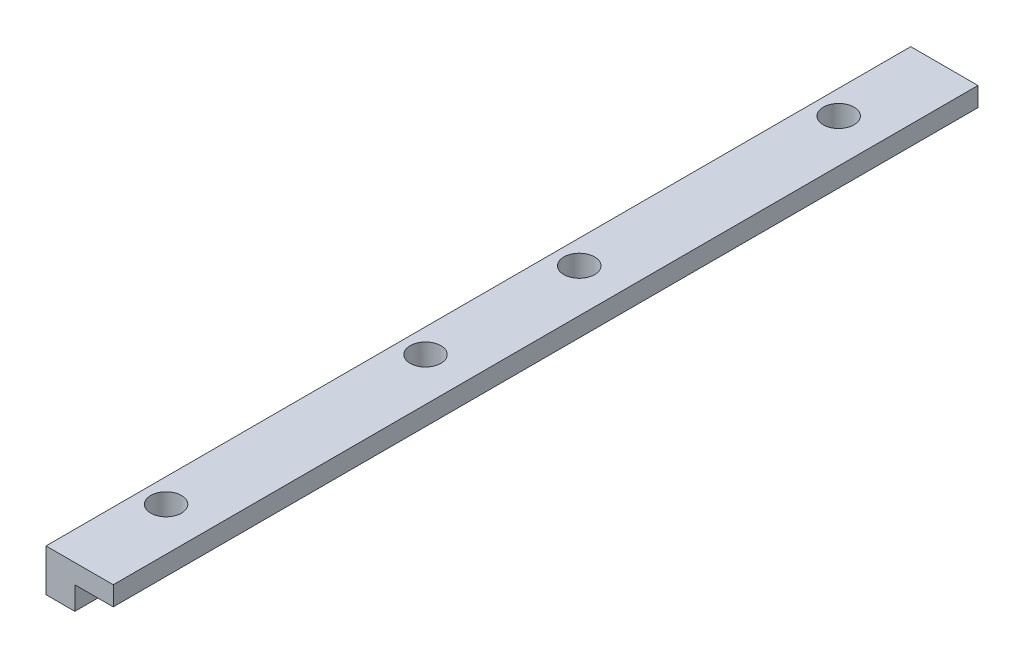
ISO-10303-21;
HEADER;
FILE_DESCRIPTION(('STEP AP214'),'2;1');
FILE_NAME('part.step','',(''),(''),'','','');
FILE_SCHEMA(('AUTOMOTIVE_DESIGN { 1 0 10303 214 1 1 1 1 }'));
ENDSEC;
DATA;
#1=APPLICATION_CONTEXT('core data for automotive mechanical design processes');
#2=APPLICATION_PROTOCOL_DEFINITION('international standard','automotive_design',2000,#1);
#3=PRODUCT_CONTEXT('',#1,'mechanical');
#4=PRODUCT('Part','Part','',(#3));
#5=PRODUCT_RELATED_PRODUCT_CATEGORY('part','',(#4));
#6=PRODUCT_DEFINITION_FORMATION('','',#4);
#7=PRODUCT_DEFINITION_CONTEXT('part definition',#1,'design');
#8=PRODUCT_DEFINITION('design','',#6,#7);
#9=PRODUCT_DEFINITION_SHAPE('','',#8);
#10=(LENGTH_UNIT() NAMED_UNIT(*) SI_UNIT(.MILLI.,.METRE.));
#11=(NAMED_UNIT(*) PLANE_ANGLE_UNIT() SI_UNIT($,.RADIAN.));
#12=(NAMED_UNIT(*) SI_UNIT($,.STERADIAN.) SOLID_ANGLE_UNIT());
#13=UNCERTAINTY_MEASURE_WITH_UNIT(LENGTH_MEASURE(1.E-05),#10,'distance_accuracy_value','');
#14=(GEOMETRIC_REPRESENTATION_CONTEXT(3) GLOBAL_UNCERTAINTY_ASSIGNED_CONTEXT((#13)) GLOBAL_UNIT_ASSIGNED_CONTEXT((#10,
#11,#12)) REPRESENTATION_CONTEXT('',''));
#15=CARTESIAN_POINT('',(0.,0.,0.));
#16=DIRECTION('',(0.,0.,1.));
#17=DIRECTION('',(1.,0.,0.));
#18=AXIS2_PLACEMENT_3D('',#15,#16,#17);
#19=CARTESIAN_POINT('',(3.,0.,90.));
#20=DIRECTION('',(-1.,0.,0.));
#21=DIRECTION('',(0.,0.,1.));
#22=AXIS2_PLACEMENT_3D('',#19,#20,#21);
#23=PLANE('',#22);
#24=DIRECTION('',(0.,0.,-1.));
#25=VECTOR('',#24,1.);
#26=CARTESIAN_POINT('',(3.,0.,90.));
#27=LINE('',#26,#25);
#28=CARTESIAN_POINT('',(3.,0.,78.4801315846429));
#29=VERTEX_POINT('',#28);
#30=CARTESIAN_POINT('',(3.,0.,54.5198684153571));
#31=VERTEX_POINT('',#30);
#32=EDGE_CURVE('E150',#29,#31,#27,.T.);
#33=ORIENTED_EDGE('',*,*,#32,.T.);
#34=DIRECTION('',(0.,1.,0.));
#35=VECTOR('',#34,1.);
#36=CARTESIAN_POINT('',(3.,0.,54.5198684153571));
#37=LINE('',#36,#35);
#38=CARTESIAN_POINT('',(3.,2.4,54.5198684153571));
#39=VERTEX_POINT('',#38);
#40=EDGE_CURVE('E134',#31,#39,#37,.T.);
#41=ORIENTED_EDGE('',*,*,#40,.T.);
#42=DIRECTION('',(0.,0.,-1.));
#43=VECTOR('',#42,1.);
#44=CARTESIAN_POINT('',(3.,2.4,90.));
#45=LINE('',#44,#43);
#46=CARTESIAN_POINT('',(3.,2.4,78.4801315846429));
#47=VERTEX_POINT('',#46);
#48=EDGE_CURVE('E167',#47,#39,#45,.T.);
#49=ORIENTED_EDGE('',*,*,#48,.F.);
#50=DIRECTION('',(0.,1.,0.));
#51=VECTOR('',#50,1.);
#52=CARTESIAN_POINT('',(3.,0.,78.4801315846429));
#53=LINE('',#52,#51);
#54=EDGE_CURVE('E58',#47,#29,#53,.F.);
#55=ORIENTED_EDGE('',*,*,#54,.T.);
#56=EDGE_LOOP('',(#33,#41,#49,#55));
#57=FACE_BOUND('',#56,.T.);
#58=ADVANCED_FACE('F35',(#57),#23,.F.);
#59=CARTESIAN_POINT('',(3.,0.,90.));
#60=VERTEX_POINT('',#59);
#61=CARTESIAN_POINT('',(3.,0.,81.5198684153571));
#62=VERTEX_POINT('',#61);
#63=EDGE_CURVE('E43',#60,#62,#27,.T.);
#64=ORIENTED_EDGE('',*,*,#63,.T.);
#65=DIRECTION('',(0.,1.,0.));
#66=VECTOR('',#65,1.);
#67=CARTESIAN_POINT('',(3.,0.,81.5198684153571));
#68=LINE('',#67,#66);
#69=CARTESIAN_POINT('',(3.,2.4,81.5198684153571));
#70=VERTEX_POINT('',#69);
#71=EDGE_CURVE('E243',#62,#70,#68,.T.);
#72=ORIENTED_EDGE('',*,*,#71,.T.);
#73=CARTESIAN_POINT('',(3.,2.4,90.));
#74=VERTEX_POINT('',#73);
#75=EDGE_CURVE('E159',#74,#70,#45,.T.);
#76=ORIENTED_EDGE('',*,*,#75,.F.);
#77=DIRECTION('',(0.,1.,0.));
#78=VECTOR('',#77,1.);
#79=CARTESIAN_POINT('',(3.,0.,90.));
#80=LINE('',#79,#78);
#81=EDGE_CURVE('E214',#60,#74,#80,.T.);
#82=ORIENTED_EDGE('',*,*,#81,.F.);
#83=EDGE_LOOP('',(#64,#72,#76,#82));
#84=FACE_BOUND('',#83,.T.);
#85=ADVANCED_FACE('F300',(#84),#23,.F.);
#86=CARTESIAN_POINT('',(3.,0.,35.4801315846429));
#87=VERTEX_POINT('',#86);
#88=CARTESIAN_POINT('',(3.,0.,11.5198684153571));
#89=VERTEX_POINT('',#88);
#90=EDGE_CURVE('E157',#87,#89,#27,.T.);
#91=ORIENTED_EDGE('',*,*,#90,.T.);
#92=DIRECTION('',(0.,1.,0.));
#93=VECTOR('',#92,1.);
#94=CARTESIAN_POINT('',(3.,0.,11.5198684153571));
#95=LINE('',#94,#93);
#96=CARTESIAN_POINT('',(3.,2.4,11.5198684153571));
#97=VERTEX_POINT('',#96);
#98=EDGE_CURVE('E231',#89,#97,#95,.T.);
#99=ORIENTED_EDGE('',*,*,#98,.T.);
#100=CARTESIAN_POINT('',(3.,2.4,35.4801315846429));
#101=VERTEX_POINT('',#100);
#102=EDGE_CURVE('E169',#101,#97,#45,.T.);
#103=ORIENTED_EDGE('',*,*,#102,.F.);
#104=DIRECTION('',(0.,1.,0.));
#105=VECTOR('',#104,1.);
#106=CARTESIAN_POINT('',(3.,0.,35.4801315846429));
#107=LINE('',#106,#105);
#108=EDGE_CURVE('E222',#101,#87,#107,.F.);
#109=ORIENTED_EDGE('',*,*,#108,.T.);
#110=EDGE_LOOP('',(#91,#99,#103,#109));
#111=FACE_BOUND('',#110,.T.);
#112=ADVANCED_FACE('F304',(#111),#23,.F.);
#113=CARTESIAN_POINT('',(3.,2.4,51.4801315846429));
#114=VERTEX_POINT('',#113);
#115=CARTESIAN_POINT('',(3.,2.4,38.5198684153571));
#116=VERTEX_POINT('',#115);
#117=EDGE_CURVE('E168',#114,#116,#45,.T.);
#118=ORIENTED_EDGE('',*,*,#117,.F.);
#119=DIRECTION('',(0.,1.,0.));
#120=VECTOR('',#119,1.);
#121=CARTESIAN_POINT('',(3.,0.,51.4801315846429));
#122=LINE('',#121,#120);
#123=CARTESIAN_POINT('',(3.,0.,51.4801315846429));
#124=VERTEX_POINT('',#123);
#125=EDGE_CURVE('E50',#114,#124,#122,.F.);
#126=ORIENTED_EDGE('',*,*,#125,.T.);
#127=CARTESIAN_POINT('',(3.,0.,38.5198684153571));
#128=VERTEX_POINT('',#127);
#129=EDGE_CURVE('E152',#124,#128,#27,.T.);
#130=ORIENTED_EDGE('',*,*,#129,.T.);
#131=DIRECTION('',(0.,1.,0.));
#132=VECTOR('',#131,1.);
#133=CARTESIAN_POINT('',(3.,0.,38.5198684153571));
#134=LINE('',#133,#132);
#135=EDGE_CURVE('E208',#128,#116,#134,.T.);
#136=ORIENTED_EDGE('',*,*,#135,.T.);
#137=EDGE_LOOP('',(#118,#126,#130,#136));
#138=FACE_BOUND('',#137,.T.);
#139=ADVANCED_FACE('F298',(#138),#23,.F.);
#140=CARTESIAN_POINT('',(0.,0.,90.));
#141=DIRECTION('',(1.,0.,0.));
#142=DIRECTION('',(0.,0.,-1.));
#143=AXIS2_PLACEMENT_3D('',#140,#141,#142);
#144=PLANE('',#143);
#145=DIRECTION('',(0.,-1.,0.));
#146=VECTOR('',#145,1.);
#147=CARTESIAN_POINT('',(0.,0.,0.));
#148=LINE('',#147,#146);
#149=CARTESIAN_POINT('',(0.,4.4,0.));
#150=VERTEX_POINT('',#149);
#151=CARTESIAN_POINT('',(0.,0.,0.));
#152=VERTEX_POINT('',#151);
#153=EDGE_CURVE('E205',#150,#152,#148,.T.);
#154=ORIENTED_EDGE('',*,*,#153,.T.);
#155=DIRECTION('',(0.,0.,-1.));
#156=VECTOR('',#155,1.);
#157=CARTESIAN_POINT('',(0.,0.,90.));
#158=LINE('',#157,#156);
#159=CARTESIAN_POINT('',(0.,0.,90.));
#160=VERTEX_POINT('',#159);
#161=EDGE_CURVE('E11',#160,#152,#158,.T.);
#162=ORIENTED_EDGE('',*,*,#161,.F.);
#163=DIRECTION('',(0.,-1.,0.));
#164=VECTOR('',#163,1.);
#165=CARTESIAN_POINT('',(0.,0.,90.));
#166=LINE('',#165,#164);
#167=CARTESIAN_POINT('',(0.,4.4,90.));
#168=VERTEX_POINT('',#167);
#169=EDGE_CURVE('E196',#168,#160,#166,.T.);
#170=ORIENTED_EDGE('',*,*,#169,.F.);
#171=DIRECTION('',(0.,0.,-1.));
#172=VECTOR('',#171,1.);
#173=CARTESIAN_POINT('',(0.,4.4,90.));
#174=LINE('',#173,#172);
#175=EDGE_CURVE('E188',#168,#150,#174,.T.);
#176=ORIENTED_EDGE('',*,*,#175,.T.);
#177=EDGE_LOOP('',(#154,#162,#170,#176));
#178=FACE_BOUND('',#177,.T.);
#179=ADVANCED_FACE('F37',(#178),#144,.F.);
#180=CARTESIAN_POINT('',(0.,0.,90.));
#181=DIRECTION('',(0.,1.,0.));
#182=DIRECTION('',(0.,0.,1.));
#183=AXIS2_PLACEMENT_3D('',#180,#181,#182);
#184=PLANE('',#183);
#185=ORIENTED_EDGE('',*,*,#129,.F.);
#186=CARTESIAN_POINT('',(2.49999999999998,0.,53.));
#187=DIRECTION('',(0.,1.,0.));
#188=DIRECTION('',(0.,0.,-1.));
#189=AXIS2_PLACEMENT_3D('',#186,#187,#188);
#190=CIRCLE('',#189,1.6);
#191=EDGE_CURVE('E137',#124,#31,#190,.T.);
#192=ORIENTED_EDGE('',*,*,#191,.T.);
#193=ORIENTED_EDGE('',*,*,#32,.F.);
#194=CARTESIAN_POINT('',(2.49999999999998,0.,80.));
#195=DIRECTION('',(0.,1.,0.));
#196=DIRECTION('',(0.,0.,-1.));
#197=AXIS2_PLACEMENT_3D('',#194,#195,#196);
#198=CIRCLE('',#197,1.6);
#199=EDGE_CURVE('E251',#29,#62,#198,.T.);
#200=ORIENTED_EDGE('',*,*,#199,.T.);
#201=ORIENTED_EDGE('',*,*,#63,.F.);
#202=DIRECTION('',(1.,0.,0.));
#203=VECTOR('',#202,1.);
#204=CARTESIAN_POINT('',(0.,0.,90.));
#205=LINE('',#204,#203);
#206=EDGE_CURVE('E216',#160,#60,#205,.T.);
#207=ORIENTED_EDGE('',*,*,#206,.F.);
#208=ORIENTED_EDGE('',*,*,#161,.T.);
#209=DIRECTION('',(1.,0.,0.));
#210=VECTOR('',#209,1.);
#211=CARTESIAN_POINT('',(0.,0.,0.));
#212=LINE('',#211,#210);
#213=CARTESIAN_POINT('',(3.,0.,0.));
#214=VERTEX_POINT('',#213);
#215=EDGE_CURVE('E203',#152,#214,#212,.T.);
#216=ORIENTED_EDGE('',*,*,#215,.T.);
#217=CARTESIAN_POINT('',(3.,0.,8.48013158464294));
#218=VERTEX_POINT('',#217);
#219=EDGE_CURVE('E155',#218,#214,#27,.T.);
#220=ORIENTED_EDGE('',*,*,#219,.F.);
#221=CARTESIAN_POINT('',(2.49999999999998,0.,9.99999999999999));
#222=DIRECTION('',(0.,1.,0.));
#223=DIRECTION('',(0.,0.,1.));
#224=AXIS2_PLACEMENT_3D('',#221,#222,#223);
#225=CIRCLE('',#224,1.6);
#226=EDGE_CURVE('E239',#218,#89,#225,.T.);
#227=ORIENTED_EDGE('',*,*,#226,.T.);
#228=ORIENTED_EDGE('',*,*,#90,.F.);
#229=CARTESIAN_POINT('',(2.49999999999998,0.,37.));
#230=DIRECTION('',(0.,1.,0.));
#231=DIRECTION('',(0.,0.,1.));
#232=AXIS2_PLACEMENT_3D('',#229,#230,#231);
#233=CIRCLE('',#232,1.6);
#234=EDGE_CURVE('E227',#87,#128,#233,.T.);
#235=ORIENTED_EDGE('',*,*,#234,.T.);
#236=EDGE_LOOP('',(#185,#192,#193,#200,#201,#207,#208,#216,#220,#227,#228,#235));
#237=FACE_BOUND('',#236,.T.);
#238=ADVANCED_FACE('F148',(#237),#184,.F.);
#239=CARTESIAN_POINT('',(3.,2.4,8.48013158464294));
#240=VERTEX_POINT('',#239);
#241=CARTESIAN_POINT('',(3.,2.4,0.));
#242=VERTEX_POINT('',#241);
#243=EDGE_CURVE('E173',#240,#242,#45,.T.);
#244=ORIENTED_EDGE('',*,*,#243,.F.);
#245=DIRECTION('',(0.,1.,0.));
#246=VECTOR('',#245,1.);
#247=CARTESIAN_POINT('',(3.,0.,8.48013158464294));
#248=LINE('',#247,#246);
#249=EDGE_CURVE('E235',#240,#218,#248,.F.);
#250=ORIENTED_EDGE('',*,*,#249,.T.);
#251=ORIENTED_EDGE('',*,*,#219,.T.);
#252=DIRECTION('',(0.,1.,0.));
#253=VECTOR('',#252,1.);
#254=CARTESIAN_POINT('',(3.,0.,0.));
#255=LINE('',#254,#253);
#256=EDGE_CURVE('E201',#214,#242,#255,.T.);
#257=ORIENTED_EDGE('',*,*,#256,.T.);
#258=EDGE_LOOP('',(#244,#250,#251,#257));
#259=FACE_BOUND('',#258,.T.);
#260=ADVANCED_FACE('F290',(#259),#23,.F.);
#261=CARTESIAN_POINT('',(3.,2.4,90.));
#262=DIRECTION('',(0.,1.,0.));
#263=DIRECTION('',(0.,0.,1.));
#264=AXIS2_PLACEMENT_3D('',#261,#262,#263);
#265=PLANE('',#264);
#266=ORIENTED_EDGE('',*,*,#48,.T.);
#267=CARTESIAN_POINT('',(2.49999999999998,2.4,53.));
#268=DIRECTION('',(0.,1.,0.));
#269=DIRECTION('',(0.,0.,1.));
#270=AXIS2_PLACEMENT_3D('',#267,#268,#269);
#271=CIRCLE('',#270,1.6);
#272=EDGE_CURVE('E138',#39,#114,#271,.T.);
#273=ORIENTED_EDGE('',*,*,#272,.T.);
#274=ORIENTED_EDGE('',*,*,#117,.T.);
#275=CARTESIAN_POINT('',(2.49999999999998,2.4,37.));
#276=DIRECTION('',(0.,1.,0.));
#277=DIRECTION('',(0.,0.,1.));
#278=AXIS2_PLACEMENT_3D('',#275,#276,#277);
#279=CIRCLE('',#278,1.6);
#280=EDGE_CURVE('E225',#116,#101,#279,.T.);
#281=ORIENTED_EDGE('',*,*,#280,.T.);
#282=ORIENTED_EDGE('',*,*,#102,.T.);
#283=CARTESIAN_POINT('',(2.49999999999998,2.4,9.99999999999999));
#284=DIRECTION('',(0.,1.,0.));
#285=DIRECTION('',(0.,0.,1.));
#286=AXIS2_PLACEMENT_3D('',#283,#284,#285);
#287=CIRCLE('',#286,1.6);
#288=EDGE_CURVE('E237',#97,#240,#287,.T.);
#289=ORIENTED_EDGE('',*,*,#288,.T.);
#290=ORIENTED_EDGE('',*,*,#243,.T.);
#291=DIRECTION('',(1.,0.,0.));
#292=VECTOR('',#291,1.);
#293=CARTESIAN_POINT('',(3.,2.4,0.));
#294=LINE('',#293,#292);
#295=CARTESIAN_POINT('',(7.,2.4,0.));
#296=VERTEX_POINT('',#295);
#297=EDGE_CURVE('E199',#242,#296,#294,.T.);
#298=ORIENTED_EDGE('',*,*,#297,.T.);
#299=DIRECTION('',(0.,0.,-1.));
#300=VECTOR('',#299,1.);
#301=CARTESIAN_POINT('',(7.,2.4,90.));
#302=LINE('',#301,#300);
#303=CARTESIAN_POINT('',(7.,2.4,90.));
#304=VERTEX_POINT('',#303);
#305=EDGE_CURVE('E179',#304,#296,#302,.T.);
#306=ORIENTED_EDGE('',*,*,#305,.F.);
#307=DIRECTION('',(1.,0.,0.));
#308=VECTOR('',#307,1.);
#309=CARTESIAN_POINT('',(3.,2.4,90.));
#310=LINE('',#309,#308);
#311=EDGE_CURVE('E212',#74,#304,#310,.T.);
#312=ORIENTED_EDGE('',*,*,#311,.F.);
#313=ORIENTED_EDGE('',*,*,#75,.T.);
#314=CARTESIAN_POINT('',(2.49999999999998,2.4,80.));
#315=DIRECTION('',(0.,1.,0.));
#316=DIRECTION('',(0.,0.,1.));
#317=AXIS2_PLACEMENT_3D('',#314,#315,#316);
#318=CIRCLE('',#317,1.6);
#319=EDGE_CURVE('E249',#70,#47,#318,.T.);
#320=ORIENTED_EDGE('',*,*,#319,.T.);
#321=EDGE_LOOP('',(#266,#273,#274,#281,#282,#289,#290,#298,#306,#312,#313,#320));
#322=FACE_BOUND('',#321,.T.);
#323=ADVANCED_FACE('F288',(#322),#265,.F.);
#324=CARTESIAN_POINT('',(7.,4.4,90.));
#325=DIRECTION('',(-1.,0.,0.));
#326=DIRECTION('',(0.,0.,1.));
#327=AXIS2_PLACEMENT_3D('',#324,#325,#326);
#328=PLANE('',#327);
#329=DIRECTION('',(0.,1.,0.));
#330=VECTOR('',#329,1.);
#331=CARTESIAN_POINT('',(7.,4.4,0.));
#332=LINE('',#331,#330);
#333=CARTESIAN_POINT('',(7.,4.4,0.));
#334=VERTEX_POINT('',#333);
#335=EDGE_CURVE('E197',#296,#334,#332,.T.);
#336=ORIENTED_EDGE('',*,*,#335,.T.);
#337=DIRECTION('',(0.,0.,-1.));
#338=VECTOR('',#337,1.);
#339=CARTESIAN_POINT('',(7.,4.4,90.));
#340=LINE('',#339,#338);
#341=CARTESIAN_POINT('',(7.,4.4,90.));
#342=VERTEX_POINT('',#341);
#343=EDGE_CURVE('E182',#342,#334,#340,.T.);
#344=ORIENTED_EDGE('',*,*,#343,.F.);
#345=DIRECTION('',(0.,1.,0.));
#346=VECTOR('',#345,1.);
#347=CARTESIAN_POINT('',(7.,4.4,90.));
#348=LINE('',#347,#346);
#349=EDGE_CURVE('E210',#304,#342,#348,.T.);
#350=ORIENTED_EDGE('',*,*,#349,.F.);
#351=ORIENTED_EDGE('',*,*,#305,.T.);
#352=EDGE_LOOP('',(#336,#344,#350,#351));
#353=FACE_BOUND('',#352,.T.);
#354=ADVANCED_FACE('F265',(#353),#328,.F.);
#355=CARTESIAN_POINT('',(0.,4.4,90.));
#356=DIRECTION('',(0.,-1.,0.));
#357=DIRECTION('',(0.,0.,-1.));
#358=AXIS2_PLACEMENT_3D('',#355,#356,#357);
#359=PLANE('',#358);
#360=CARTESIAN_POINT('',(2.49999999999998,4.4,53.));
#361=DIRECTION('',(0.,1.,0.));
#362=DIRECTION('',(0.,0.,-1.));
#363=AXIS2_PLACEMENT_3D('',#360,#361,#362);
#364=CIRCLE('',#363,1.6);
#365=CARTESIAN_POINT('',(2.49999999999998,4.4,51.4));
#366=VERTEX_POINT('',#365);
#367=EDGE_CURVE('E153',#366,#366,#364,.T.);
#368=ORIENTED_EDGE('',*,*,#367,.F.);
#369=EDGE_LOOP('',(#368));
#370=FACE_BOUND('',#369,.T.);
#371=CARTESIAN_POINT('',(2.49999999999998,4.4,80.));
#372=DIRECTION('',(0.,1.,0.));
#373=DIRECTION('',(0.,0.,-1.));
#374=AXIS2_PLACEMENT_3D('',#371,#372,#373);
#375=CIRCLE('',#374,1.6);
#376=CARTESIAN_POINT('',(2.49999999999998,4.4,78.4));
#377=VERTEX_POINT('',#376);
#378=EDGE_CURVE('E143',#377,#377,#375,.T.);
#379=ORIENTED_EDGE('',*,*,#378,.F.);
#380=EDGE_LOOP('',(#379));
#381=FACE_BOUND('',#380,.T.);
#382=CARTESIAN_POINT('',(2.49999999999998,4.4,9.99999999999999));
#383=DIRECTION('',(0.,1.,0.));
#384=DIRECTION('',(0.,0.,1.));
#385=AXIS2_PLACEMENT_3D('',#382,#383,#384);
#386=CIRCLE('',#385,1.6);
#387=CARTESIAN_POINT('',(2.49999999999998,4.4,11.6));
#388=VERTEX_POINT('',#387);
#389=EDGE_CURVE('E240',#388,#388,#386,.T.);
#390=ORIENTED_EDGE('',*,*,#389,.F.);
#391=EDGE_LOOP('',(#390));
#392=FACE_BOUND('',#391,.T.);
#393=CARTESIAN_POINT('',(2.49999999999998,4.4,37.));
#394=DIRECTION('',(0.,1.,0.));
#395=DIRECTION('',(0.,0.,1.));
#396=AXIS2_PLACEMENT_3D('',#393,#394,#395);
#397=CIRCLE('',#396,1.6);
#398=CARTESIAN_POINT('',(2.49999999999998,4.4,38.6));
#399=VERTEX_POINT('',#398);
#400=EDGE_CURVE('E228',#399,#399,#397,.T.);
#401=ORIENTED_EDGE('',*,*,#400,.F.);
#402=EDGE_LOOP('',(#401));
#403=FACE_BOUND('',#402,.T.);
#404=DIRECTION('',(-1.,0.,0.));
#405=VECTOR('',#404,1.);
#406=CARTESIAN_POINT('',(0.,4.4,0.));
#407=LINE('',#406,#405);
#408=EDGE_CURVE('E194',#334,#150,#407,.T.);
#409=ORIENTED_EDGE('',*,*,#408,.T.);
#410=ORIENTED_EDGE('',*,*,#175,.F.);
#411=DIRECTION('',(-1.,0.,0.));
#412=VECTOR('',#411,1.);
#413=CARTESIAN_POINT('',(0.,4.4,90.));
#414=LINE('',#413,#412);
#415=EDGE_CURVE('E193',#342,#168,#414,.T.);
#416=ORIENTED_EDGE('',*,*,#415,.F.);
#417=ORIENTED_EDGE('',*,*,#343,.T.);
#418=EDGE_LOOP('',(#409,#410,#416,#417));
#419=FACE_BOUND('',#418,.T.);
#420=ADVANCED_FACE('F261',(#370,#381,#392,#403,#419),#359,.F.);
#421=CARTESIAN_POINT('',(0.,0.,90.));
#422=DIRECTION('',(0.,0.,-1.));
#423=DIRECTION('',(-1.,0.,0.));
#424=AXIS2_PLACEMENT_3D('',#421,#422,#423);
#425=PLANE('',#424);
#426=ORIENTED_EDGE('',*,*,#169,.T.);
#427=ORIENTED_EDGE('',*,*,#206,.T.);
#428=ORIENTED_EDGE('',*,*,#81,.T.);
#429=ORIENTED_EDGE('',*,*,#311,.T.);
#430=ORIENTED_EDGE('',*,*,#349,.T.);
#431=ORIENTED_EDGE('',*,*,#415,.T.);
#432=EDGE_LOOP('',(#426,#427,#428,#429,#430,#431));
#433=FACE_BOUND('',#432,.T.);
#434=ADVANCED_FACE('F264',(#433),#425,.F.);
#435=CARTESIAN_POINT('',(0.,0.,0.));
#436=DIRECTION('',(0.,0.,-1.));
#437=DIRECTION('',(-1.,0.,0.));
#438=AXIS2_PLACEMENT_3D('',#435,#436,#437);
#439=PLANE('',#438);
#440=ORIENTED_EDGE('',*,*,#153,.F.);
#441=ORIENTED_EDGE('',*,*,#408,.F.);
#442=ORIENTED_EDGE('',*,*,#335,.F.);
#443=ORIENTED_EDGE('',*,*,#297,.F.);
#444=ORIENTED_EDGE('',*,*,#256,.F.);
#445=ORIENTED_EDGE('',*,*,#215,.F.);
#446=EDGE_LOOP('',(#440,#441,#442,#443,#444,#445));
#447=FACE_BOUND('',#446,.T.);
#448=ADVANCED_FACE('F282',(#447),#439,.T.);
#449=CARTESIAN_POINT('',(2.49999999999998,0.,37.));
#450=DIRECTION('',(0.,1.,0.));
#451=DIRECTION('',(0.,0.,1.));
#452=AXIS2_PLACEMENT_3D('',#449,#450,#451);
#453=CYLINDRICAL_SURFACE('',#452,1.6);
#454=ORIENTED_EDGE('',*,*,#400,.T.);
#455=EDGE_LOOP('',(#454));
#456=FACE_BOUND('',#455,.T.);
#457=ORIENTED_EDGE('',*,*,#234,.F.);
#458=ORIENTED_EDGE('',*,*,#108,.F.);
#459=ORIENTED_EDGE('',*,*,#280,.F.);
#460=ORIENTED_EDGE('',*,*,#135,.F.);
#461=EDGE_LOOP('',(#457,#458,#459,#460));
#462=FACE_BOUND('',#461,.T.);
#463=ADVANCED_FACE('F322',(#456,#462),#453,.F.);
#464=CARTESIAN_POINT('',(2.49999999999998,0.,9.99999999999999));
#465=DIRECTION('',(0.,1.,0.));
#466=DIRECTION('',(0.,0.,1.));
#467=AXIS2_PLACEMENT_3D('',#464,#465,#466);
#468=CYLINDRICAL_SURFACE('',#467,1.6);
#469=ORIENTED_EDGE('',*,*,#389,.T.);
#470=EDGE_LOOP('',(#469));
#471=FACE_BOUND('',#470,.T.);
#472=ORIENTED_EDGE('',*,*,#226,.F.);
#473=ORIENTED_EDGE('',*,*,#249,.F.);
#474=ORIENTED_EDGE('',*,*,#288,.F.);
#475=ORIENTED_EDGE('',*,*,#98,.F.);
#476=EDGE_LOOP('',(#472,#473,#474,#475));
#477=FACE_BOUND('',#476,.T.);
#478=ADVANCED_FACE('F325',(#471,#477),#468,.F.);
#479=CARTESIAN_POINT('',(2.49999999999998,0.,80.));
#480=DIRECTION('',(0.,1.,0.));
#481=DIRECTION('',(0.,0.,1.));
#482=AXIS2_PLACEMENT_3D('',#479,#480,#481);
#483=CYLINDRICAL_SURFACE('',#482,1.6);
#484=ORIENTED_EDGE('',*,*,#378,.T.);
#485=EDGE_LOOP('',(#484));
#486=FACE_BOUND('',#485,.T.);
#487=ORIENTED_EDGE('',*,*,#199,.F.);
#488=ORIENTED_EDGE('',*,*,#54,.F.);
#489=ORIENTED_EDGE('',*,*,#319,.F.);
#490=ORIENTED_EDGE('',*,*,#71,.F.);
#491=EDGE_LOOP('',(#487,#488,#489,#490));
#492=FACE_BOUND('',#491,.T.);
#493=ADVANCED_FACE('F327',(#486,#492),#483,.F.);
#494=CARTESIAN_POINT('',(2.49999999999998,0.,53.));
#495=DIRECTION('',(0.,1.,0.));
#496=DIRECTION('',(0.,0.,1.));
#497=AXIS2_PLACEMENT_3D('',#494,#495,#496);
#498=CYLINDRICAL_SURFACE('',#497,1.6);
#499=ORIENTED_EDGE('',*,*,#367,.T.);
#500=EDGE_LOOP('',(#499));
#501=FACE_BOUND('',#500,.T.);
#502=ORIENTED_EDGE('',*,*,#191,.F.);
#503=ORIENTED_EDGE('',*,*,#125,.F.);
#504=ORIENTED_EDGE('',*,*,#272,.F.);
#505=ORIENTED_EDGE('',*,*,#40,.F.);
#506=EDGE_LOOP('',(#502,#503,#504,#505));
#507=FACE_BOUND('',#506,.T.);
#508=ADVANCED_FACE('F136',(#501,#507),#498,.F.);
#509=CLOSED_SHELL('',(#58,#85,#112,#139,#179,#238,#260,#323,#354,#420,#434,#448,#463,#478,#493,#508));
#510=MANIFOLD_SOLID_BREP('B2',#509);
#511=ADVANCED_BREP_SHAPE_REPRESENTATION('',(#18,#510),#14);
#512=SHAPE_DEFINITION_REPRESENTATION(#9,#511);
ENDSEC;
END-ISO-10303-21;
